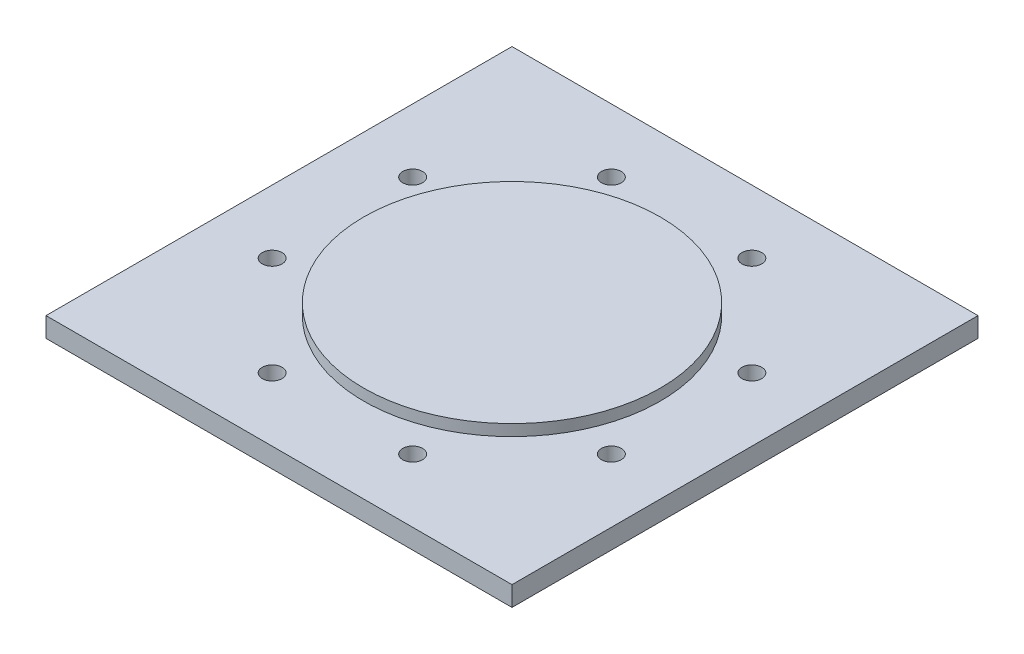
ISO-10303-21;
HEADER;
FILE_DESCRIPTION(('STEP AP214'),'2;1');
FILE_NAME('part.step','',(''),(''),'','','');
FILE_SCHEMA(('AUTOMOTIVE_DESIGN { 1 0 10303 214 1 1 1 1 }'));
ENDSEC;
DATA;
#1=APPLICATION_CONTEXT('core data for automotive mechanical design processes');
#2=APPLICATION_PROTOCOL_DEFINITION('international standard','automotive_design',2000,#1);
#3=PRODUCT_CONTEXT('',#1,'mechanical');
#4=PRODUCT('Part','Part','',(#3));
#5=PRODUCT_RELATED_PRODUCT_CATEGORY('part','',(#4));
#6=PRODUCT_DEFINITION_FORMATION('','',#4);
#7=PRODUCT_DEFINITION_CONTEXT('part definition',#1,'design');
#8=PRODUCT_DEFINITION('design','',#6,#7);
#9=PRODUCT_DEFINITION_SHAPE('','',#8);
#10=(LENGTH_UNIT() NAMED_UNIT(*) SI_UNIT(.MILLI.,.METRE.));
#11=(NAMED_UNIT(*) PLANE_ANGLE_UNIT() SI_UNIT($,.RADIAN.));
#12=(NAMED_UNIT(*) SI_UNIT($,.STERADIAN.) SOLID_ANGLE_UNIT());
#13=UNCERTAINTY_MEASURE_WITH_UNIT(LENGTH_MEASURE(1.E-05),#10,'distance_accuracy_value','');
#14=(GEOMETRIC_REPRESENTATION_CONTEXT(3) GLOBAL_UNCERTAINTY_ASSIGNED_CONTEXT((#13)) GLOBAL_UNIT_ASSIGNED_CONTEXT((#10,
#11,#12)) REPRESENTATION_CONTEXT('',''));
#15=CARTESIAN_POINT('',(0.,0.,0.));
#16=DIRECTION('',(0.,0.,1.));
#17=DIRECTION('',(1.,0.,0.));
#18=AXIS2_PLACEMENT_3D('',#15,#16,#17);
#19=CARTESIAN_POINT('',(0.,14.,0.));
#20=DIRECTION('',(0.,-1.,0.));
#21=DIRECTION('',(0.,0.,-1.));
#22=AXIS2_PLACEMENT_3D('',#19,#20,#21);
#23=PLANE('',#22);
#24=CARTESIAN_POINT('',(0.,14.,0.));
#25=DIRECTION('',(0.,-1.,0.));
#26=DIRECTION('',(0.,0.,-1.));
#27=AXIS2_PLACEMENT_3D('',#24,#25,#26);
#28=CIRCLE('',#27,105.);
#29=CARTESIAN_POINT('',(0.,14.,-105.));
#30=VERTEX_POINT('',#29);
#31=EDGE_CURVE('E11',#30,#30,#28,.F.);
#32=ORIENTED_EDGE('',*,*,#31,.F.);
#33=EDGE_LOOP('',(#32));
#34=FACE_BOUND('',#33,.T.);
#35=DIRECTION('',(0.,0.,-1.));
#36=VECTOR('',#35,1.);
#37=CARTESIAN_POINT('',(165.,14.,165.));
#38=LINE('',#37,#36);
#39=CARTESIAN_POINT('',(165.,14.,165.));
#40=VERTEX_POINT('',#39);
#41=CARTESIAN_POINT('',(165.,14.,-165.));
#42=VERTEX_POINT('',#41);
#43=EDGE_CURVE('E93',#40,#42,#38,.T.);
#44=ORIENTED_EDGE('',*,*,#43,.T.);
#45=DIRECTION('',(-1.,0.,0.));
#46=VECTOR('',#45,1.);
#47=CARTESIAN_POINT('',(-165.,14.,-165.));
#48=LINE('',#47,#46);
#49=CARTESIAN_POINT('',(-165.,14.,-165.));
#50=VERTEX_POINT('',#49);
#51=EDGE_CURVE('E88',#42,#50,#48,.T.);
#52=ORIENTED_EDGE('',*,*,#51,.T.);
#53=DIRECTION('',(0.,0.,1.));
#54=VECTOR('',#53,1.);
#55=CARTESIAN_POINT('',(-165.,14.,165.));
#56=LINE('',#55,#54);
#57=CARTESIAN_POINT('',(-165.,14.,165.));
#58=VERTEX_POINT('',#57);
#59=EDGE_CURVE('E91',#50,#58,#56,.T.);
#60=ORIENTED_EDGE('',*,*,#59,.T.);
#61=DIRECTION('',(1.,0.,0.));
#62=VECTOR('',#61,1.);
#63=CARTESIAN_POINT('',(-165.,14.,165.));
#64=LINE('',#63,#62);
#65=EDGE_CURVE('E57',#58,#40,#64,.T.);
#66=ORIENTED_EDGE('',*,*,#65,.T.);
#67=EDGE_LOOP('',(#44,#52,#60,#66));
#68=FACE_BOUND('',#67,.T.);
#69=CARTESIAN_POINT('',(120.104339226467,14.,-49.7488462074617));
#70=DIRECTION('',(0.,1.,0.));
#71=DIRECTION('',(0.,0.,1.));
#72=AXIS2_PLACEMENT_3D('',#69,#70,#71);
#73=CIRCLE('',#72,7.);
#74=CARTESIAN_POINT('',(120.104339226467,14.,-42.7488462074617));
#75=VERTEX_POINT('',#74);
#76=EDGE_CURVE('E109',#75,#75,#73,.T.);
#77=ORIENTED_EDGE('',*,*,#76,.F.);
#78=EDGE_LOOP('',(#77));
#79=FACE_BOUND('',#78,.T.);
#80=CARTESIAN_POINT('',(49.7488462074617,14.,-120.104339226467));
#81=DIRECTION('',(0.,1.,0.));
#82=DIRECTION('',(0.,0.,1.));
#83=AXIS2_PLACEMENT_3D('',#80,#81,#82);
#84=CIRCLE('',#83,7.);
#85=CARTESIAN_POINT('',(49.7488462074617,14.,-113.104339226467));
#86=VERTEX_POINT('',#85);
#87=EDGE_CURVE('E124',#86,#86,#84,.T.);
#88=ORIENTED_EDGE('',*,*,#87,.F.);
#89=EDGE_LOOP('',(#88));
#90=FACE_BOUND('',#89,.T.);
#91=CARTESIAN_POINT('',(-49.7488462074617,14.,-120.104339226467));
#92=DIRECTION('',(0.,1.,0.));
#93=DIRECTION('',(0.,0.,1.));
#94=AXIS2_PLACEMENT_3D('',#91,#92,#93);
#95=CIRCLE('',#94,7.);
#96=CARTESIAN_POINT('',(-49.7488462074617,14.,-113.104339226467));
#97=VERTEX_POINT('',#96);
#98=EDGE_CURVE('E130',#97,#97,#95,.T.);
#99=ORIENTED_EDGE('',*,*,#98,.F.);
#100=EDGE_LOOP('',(#99));
#101=FACE_BOUND('',#100,.T.);
#102=CARTESIAN_POINT('',(-120.104339226467,14.,-49.7488462074617));
#103=DIRECTION('',(0.,1.,0.));
#104=DIRECTION('',(0.,0.,1.));
#105=AXIS2_PLACEMENT_3D('',#102,#103,#104);
#106=CIRCLE('',#105,7.);
#107=CARTESIAN_POINT('',(-120.104339226467,14.,-42.7488462074617));
#108=VERTEX_POINT('',#107);
#109=EDGE_CURVE('E136',#108,#108,#106,.T.);
#110=ORIENTED_EDGE('',*,*,#109,.F.);
#111=EDGE_LOOP('',(#110));
#112=FACE_BOUND('',#111,.T.);
#113=CARTESIAN_POINT('',(-120.104339226467,14.,49.7488462074617));
#114=DIRECTION('',(0.,1.,0.));
#115=DIRECTION('',(0.,0.,1.));
#116=AXIS2_PLACEMENT_3D('',#113,#114,#115);
#117=CIRCLE('',#116,7.);
#118=CARTESIAN_POINT('',(-120.104339226467,14.,56.7488462074617));
#119=VERTEX_POINT('',#118);
#120=EDGE_CURVE('E142',#119,#119,#117,.T.);
#121=ORIENTED_EDGE('',*,*,#120,.F.);
#122=EDGE_LOOP('',(#121));
#123=FACE_BOUND('',#122,.T.);
#124=CARTESIAN_POINT('',(-49.7488462074617,14.,120.104339226467));
#125=DIRECTION('',(0.,1.,0.));
#126=DIRECTION('',(0.,0.,1.));
#127=AXIS2_PLACEMENT_3D('',#124,#125,#126);
#128=CIRCLE('',#127,7.00000000000003);
#129=CARTESIAN_POINT('',(-49.7488462074617,14.,127.104339226467));
#130=VERTEX_POINT('',#129);
#131=EDGE_CURVE('E148',#130,#130,#128,.T.);
#132=ORIENTED_EDGE('',*,*,#131,.F.);
#133=EDGE_LOOP('',(#132));
#134=FACE_BOUND('',#133,.T.);
#135=CARTESIAN_POINT('',(49.7488462074617,14.,120.104339226467));
#136=DIRECTION('',(0.,1.,0.));
#137=DIRECTION('',(0.,0.,1.));
#138=AXIS2_PLACEMENT_3D('',#135,#136,#137);
#139=CIRCLE('',#138,7.00000000000002);
#140=CARTESIAN_POINT('',(49.7488462074617,14.,127.104339226467));
#141=VERTEX_POINT('',#140);
#142=EDGE_CURVE('E154',#141,#141,#139,.T.);
#143=ORIENTED_EDGE('',*,*,#142,.F.);
#144=EDGE_LOOP('',(#143));
#145=FACE_BOUND('',#144,.T.);
#146=CARTESIAN_POINT('',(120.104339226467,14.,49.7488462074617));
#147=DIRECTION('',(0.,1.,0.));
#148=DIRECTION('',(0.,0.,1.));
#149=AXIS2_PLACEMENT_3D('',#146,#147,#148);
#150=CIRCLE('',#149,7.00000000000003);
#151=CARTESIAN_POINT('',(120.104339226467,14.,56.7488462074617));
#152=VERTEX_POINT('',#151);
#153=EDGE_CURVE('E160',#152,#152,#150,.T.);
#154=ORIENTED_EDGE('',*,*,#153,.F.);
#155=EDGE_LOOP('',(#154));
#156=FACE_BOUND('',#155,.T.);
#157=ADVANCED_FACE('F39',(#34,#68,#79,#90,#101,#112,#123,#134,#145,#156),#23,.F.);
#158=CARTESIAN_POINT('',(0.,0.,0.));
#159=DIRECTION('',(0.,-1.,0.));
#160=DIRECTION('',(0.,0.,-1.));
#161=AXIS2_PLACEMENT_3D('',#158,#159,#160);
#162=PLANE('',#161);
#163=CARTESIAN_POINT('',(49.7488462074617,0.,120.104339226467));
#164=DIRECTION('',(0.,1.,0.));
#165=DIRECTION('',(0.,0.,1.));
#166=AXIS2_PLACEMENT_3D('',#163,#164,#165);
#167=CIRCLE('',#166,7.00000000000002);
#168=CARTESIAN_POINT('',(49.7488462074617,0.,127.104339226467));
#169=VERTEX_POINT('',#168);
#170=EDGE_CURVE('E157',#169,#169,#167,.T.);
#171=ORIENTED_EDGE('',*,*,#170,.T.);
#172=EDGE_LOOP('',(#171));
#173=FACE_BOUND('',#172,.T.);
#174=CARTESIAN_POINT('',(-120.104339226467,0.,49.7488462074617));
#175=DIRECTION('',(0.,1.,0.));
#176=DIRECTION('',(0.,0.,1.));
#177=AXIS2_PLACEMENT_3D('',#174,#175,#176);
#178=CIRCLE('',#177,7.);
#179=CARTESIAN_POINT('',(-120.104339226467,0.,56.7488462074617));
#180=VERTEX_POINT('',#179);
#181=EDGE_CURVE('E145',#180,#180,#178,.T.);
#182=ORIENTED_EDGE('',*,*,#181,.T.);
#183=EDGE_LOOP('',(#182));
#184=FACE_BOUND('',#183,.T.);
#185=CARTESIAN_POINT('',(-49.7488462074617,0.,-120.104339226467));
#186=DIRECTION('',(0.,1.,0.));
#187=DIRECTION('',(0.,0.,1.));
#188=AXIS2_PLACEMENT_3D('',#185,#186,#187);
#189=CIRCLE('',#188,7.);
#190=CARTESIAN_POINT('',(-49.7488462074617,0.,-113.104339226467));
#191=VERTEX_POINT('',#190);
#192=EDGE_CURVE('E133',#191,#191,#189,.T.);
#193=ORIENTED_EDGE('',*,*,#192,.T.);
#194=EDGE_LOOP('',(#193));
#195=FACE_BOUND('',#194,.T.);
#196=CARTESIAN_POINT('',(120.104339226467,0.,-49.7488462074617));
#197=DIRECTION('',(0.,1.,0.));
#198=DIRECTION('',(0.,0.,1.));
#199=AXIS2_PLACEMENT_3D('',#196,#197,#198);
#200=CIRCLE('',#199,7.);
#201=CARTESIAN_POINT('',(120.104339226467,0.,-42.7488462074617));
#202=VERTEX_POINT('',#201);
#203=EDGE_CURVE('E121',#202,#202,#200,.T.);
#204=ORIENTED_EDGE('',*,*,#203,.T.);
#205=EDGE_LOOP('',(#204));
#206=FACE_BOUND('',#205,.T.);
#207=DIRECTION('',(0.,0.,-1.));
#208=VECTOR('',#207,1.);
#209=CARTESIAN_POINT('',(165.,0.,165.));
#210=LINE('',#209,#208);
#211=CARTESIAN_POINT('',(165.,0.,165.));
#212=VERTEX_POINT('',#211);
#213=CARTESIAN_POINT('',(165.,0.,-165.));
#214=VERTEX_POINT('',#213);
#215=EDGE_CURVE('E106',#212,#214,#210,.T.);
#216=ORIENTED_EDGE('',*,*,#215,.F.);
#217=DIRECTION('',(1.,0.,0.));
#218=VECTOR('',#217,1.);
#219=CARTESIAN_POINT('',(-165.,0.,165.));
#220=LINE('',#219,#218);
#221=CARTESIAN_POINT('',(-165.,0.,165.));
#222=VERTEX_POINT('',#221);
#223=EDGE_CURVE('E80',#222,#212,#220,.T.);
#224=ORIENTED_EDGE('',*,*,#223,.F.);
#225=DIRECTION('',(0.,0.,1.));
#226=VECTOR('',#225,1.);
#227=CARTESIAN_POINT('',(-165.,0.,165.));
#228=LINE('',#227,#226);
#229=CARTESIAN_POINT('',(-165.,0.,-165.));
#230=VERTEX_POINT('',#229);
#231=EDGE_CURVE('E74',#230,#222,#228,.T.);
#232=ORIENTED_EDGE('',*,*,#231,.F.);
#233=DIRECTION('',(-1.,0.,0.));
#234=VECTOR('',#233,1.);
#235=CARTESIAN_POINT('',(-165.,0.,-165.));
#236=LINE('',#235,#234);
#237=EDGE_CURVE('E98',#214,#230,#236,.T.);
#238=ORIENTED_EDGE('',*,*,#237,.F.);
#239=EDGE_LOOP('',(#216,#224,#232,#238));
#240=FACE_BOUND('',#239,.T.);
#241=CARTESIAN_POINT('',(49.7488462074617,0.,-120.104339226467));
#242=DIRECTION('',(0.,1.,0.));
#243=DIRECTION('',(0.,0.,1.));
#244=AXIS2_PLACEMENT_3D('',#241,#242,#243);
#245=CIRCLE('',#244,7.);
#246=CARTESIAN_POINT('',(49.7488462074617,0.,-113.104339226467));
#247=VERTEX_POINT('',#246);
#248=EDGE_CURVE('E127',#247,#247,#245,.T.);
#249=ORIENTED_EDGE('',*,*,#248,.T.);
#250=EDGE_LOOP('',(#249));
#251=FACE_BOUND('',#250,.T.);
#252=CARTESIAN_POINT('',(-120.104339226467,0.,-49.7488462074617));
#253=DIRECTION('',(0.,1.,0.));
#254=DIRECTION('',(0.,0.,1.));
#255=AXIS2_PLACEMENT_3D('',#252,#253,#254);
#256=CIRCLE('',#255,7.);
#257=CARTESIAN_POINT('',(-120.104339226467,0.,-42.7488462074617));
#258=VERTEX_POINT('',#257);
#259=EDGE_CURVE('E139',#258,#258,#256,.T.);
#260=ORIENTED_EDGE('',*,*,#259,.T.);
#261=EDGE_LOOP('',(#260));
#262=FACE_BOUND('',#261,.T.);
#263=CARTESIAN_POINT('',(-49.7488462074617,0.,120.104339226467));
#264=DIRECTION('',(0.,1.,0.));
#265=DIRECTION('',(0.,0.,1.));
#266=AXIS2_PLACEMENT_3D('',#263,#264,#265);
#267=CIRCLE('',#266,7.00000000000003);
#268=CARTESIAN_POINT('',(-49.7488462074617,0.,127.104339226467));
#269=VERTEX_POINT('',#268);
#270=EDGE_CURVE('E151',#269,#269,#267,.T.);
#271=ORIENTED_EDGE('',*,*,#270,.T.);
#272=EDGE_LOOP('',(#271));
#273=FACE_BOUND('',#272,.T.);
#274=CARTESIAN_POINT('',(120.104339226467,0.,49.7488462074617));
#275=DIRECTION('',(0.,1.,0.));
#276=DIRECTION('',(0.,0.,1.));
#277=AXIS2_PLACEMENT_3D('',#274,#275,#276);
#278=CIRCLE('',#277,7.00000000000003);
#279=CARTESIAN_POINT('',(120.104339226467,0.,56.7488462074617));
#280=VERTEX_POINT('',#279);
#281=EDGE_CURVE('E163',#280,#280,#278,.T.);
#282=ORIENTED_EDGE('',*,*,#281,.T.);
#283=EDGE_LOOP('',(#282));
#284=FACE_BOUND('',#283,.T.);
#285=ADVANCED_FACE('F117',(#173,#184,#195,#206,#240,#251,#262,#273,#284),#162,.T.);
#286=CARTESIAN_POINT('',(165.,14.,165.));
#287=DIRECTION('',(-1.,0.,0.));
#288=DIRECTION('',(0.,0.,1.));
#289=AXIS2_PLACEMENT_3D('',#286,#287,#288);
#290=PLANE('',#289);
#291=ORIENTED_EDGE('',*,*,#215,.T.);
#292=DIRECTION('',(0.,-1.,0.));
#293=VECTOR('',#292,1.);
#294=CARTESIAN_POINT('',(165.,14.,-165.));
#295=LINE('',#294,#293);
#296=EDGE_CURVE('E43',#42,#214,#295,.T.);
#297=ORIENTED_EDGE('',*,*,#296,.F.);
#298=ORIENTED_EDGE('',*,*,#43,.F.);
#299=DIRECTION('',(0.,-1.,0.));
#300=VECTOR('',#299,1.);
#301=CARTESIAN_POINT('',(165.,14.,165.));
#302=LINE('',#301,#300);
#303=EDGE_CURVE('E102',#40,#212,#302,.T.);
#304=ORIENTED_EDGE('',*,*,#303,.T.);
#305=EDGE_LOOP('',(#291,#297,#298,#304));
#306=FACE_BOUND('',#305,.T.);
#307=ADVANCED_FACE('F41',(#306),#290,.F.);
#308=CARTESIAN_POINT('',(-165.,14.,-165.));
#309=DIRECTION('',(0.,0.,1.));
#310=DIRECTION('',(1.,0.,0.));
#311=AXIS2_PLACEMENT_3D('',#308,#309,#310);
#312=PLANE('',#311);
#313=ORIENTED_EDGE('',*,*,#237,.T.);
#314=DIRECTION('',(0.,-1.,0.));
#315=VECTOR('',#314,1.);
#316=CARTESIAN_POINT('',(-165.,14.,-165.));
#317=LINE('',#316,#315);
#318=EDGE_CURVE('E96',#50,#230,#317,.T.);
#319=ORIENTED_EDGE('',*,*,#318,.F.);
#320=ORIENTED_EDGE('',*,*,#51,.F.);
#321=ORIENTED_EDGE('',*,*,#296,.T.);
#322=EDGE_LOOP('',(#313,#319,#320,#321));
#323=FACE_BOUND('',#322,.T.);
#324=ADVANCED_FACE('F97',(#323),#312,.F.);
#325=CARTESIAN_POINT('',(-165.,14.,165.));
#326=DIRECTION('',(1.,0.,0.));
#327=DIRECTION('',(0.,0.,-1.));
#328=AXIS2_PLACEMENT_3D('',#325,#326,#327);
#329=PLANE('',#328);
#330=ORIENTED_EDGE('',*,*,#231,.T.);
#331=DIRECTION('',(0.,-1.,0.));
#332=VECTOR('',#331,1.);
#333=CARTESIAN_POINT('',(-165.,14.,165.));
#334=LINE('',#333,#332);
#335=EDGE_CURVE('E99',#58,#222,#334,.T.);
#336=ORIENTED_EDGE('',*,*,#335,.F.);
#337=ORIENTED_EDGE('',*,*,#59,.F.);
#338=ORIENTED_EDGE('',*,*,#318,.T.);
#339=EDGE_LOOP('',(#330,#336,#337,#338));
#340=FACE_BOUND('',#339,.T.);
#341=ADVANCED_FACE('F100',(#340),#329,.F.);
#342=CARTESIAN_POINT('',(-165.,14.,165.));
#343=DIRECTION('',(0.,0.,-1.));
#344=DIRECTION('',(-1.,0.,0.));
#345=AXIS2_PLACEMENT_3D('',#342,#343,#344);
#346=PLANE('',#345);
#347=ORIENTED_EDGE('',*,*,#223,.T.);
#348=ORIENTED_EDGE('',*,*,#303,.F.);
#349=ORIENTED_EDGE('',*,*,#65,.F.);
#350=ORIENTED_EDGE('',*,*,#335,.T.);
#351=EDGE_LOOP('',(#347,#348,#349,#350));
#352=FACE_BOUND('',#351,.T.);
#353=ADVANCED_FACE('F114',(#352),#346,.F.);
#354=CARTESIAN_POINT('',(120.104339226467,14.,-49.7488462074617));
#355=DIRECTION('',(0.,-1.,0.));
#356=DIRECTION('',(0.,0.,-1.));
#357=AXIS2_PLACEMENT_3D('',#354,#355,#356);
#358=CYLINDRICAL_SURFACE('',#357,7.);
#359=ORIENTED_EDGE('',*,*,#76,.T.);
#360=EDGE_LOOP('',(#359));
#361=FACE_BOUND('',#360,.T.);
#362=ORIENTED_EDGE('',*,*,#203,.F.);
#363=EDGE_LOOP('',(#362));
#364=FACE_BOUND('',#363,.T.);
#365=ADVANCED_FACE('F189',(#361,#364),#358,.F.);
#366=CARTESIAN_POINT('',(49.7488462074617,14.,-120.104339226467));
#367=DIRECTION('',(0.,-1.,0.));
#368=DIRECTION('',(0.,0.,-1.));
#369=AXIS2_PLACEMENT_3D('',#366,#367,#368);
#370=CYLINDRICAL_SURFACE('',#369,7.);
#371=ORIENTED_EDGE('',*,*,#87,.T.);
#372=EDGE_LOOP('',(#371));
#373=FACE_BOUND('',#372,.T.);
#374=ORIENTED_EDGE('',*,*,#248,.F.);
#375=EDGE_LOOP('',(#374));
#376=FACE_BOUND('',#375,.T.);
#377=ADVANCED_FACE('F285',(#373,#376),#370,.F.);
#378=CARTESIAN_POINT('',(-49.7488462074617,14.,-120.104339226467));
#379=DIRECTION('',(0.,-1.,0.));
#380=DIRECTION('',(0.,0.,-1.));
#381=AXIS2_PLACEMENT_3D('',#378,#379,#380);
#382=CYLINDRICAL_SURFACE('',#381,7.);
#383=ORIENTED_EDGE('',*,*,#98,.T.);
#384=EDGE_LOOP('',(#383));
#385=FACE_BOUND('',#384,.T.);
#386=ORIENTED_EDGE('',*,*,#192,.F.);
#387=EDGE_LOOP('',(#386));
#388=FACE_BOUND('',#387,.T.);
#389=ADVANCED_FACE('F275',(#385,#388),#382,.F.);
#390=CARTESIAN_POINT('',(-120.104339226467,14.,-49.7488462074617));
#391=DIRECTION('',(0.,-1.,0.));
#392=DIRECTION('',(0.,0.,-1.));
#393=AXIS2_PLACEMENT_3D('',#390,#391,#392);
#394=CYLINDRICAL_SURFACE('',#393,7.);
#395=ORIENTED_EDGE('',*,*,#109,.T.);
#396=EDGE_LOOP('',(#395));
#397=FACE_BOUND('',#396,.T.);
#398=ORIENTED_EDGE('',*,*,#259,.F.);
#399=EDGE_LOOP('',(#398));
#400=FACE_BOUND('',#399,.T.);
#401=ADVANCED_FACE('F265',(#397,#400),#394,.F.);
#402=CARTESIAN_POINT('',(-120.104339226467,14.,49.7488462074617));
#403=DIRECTION('',(0.,-1.,0.));
#404=DIRECTION('',(0.,0.,-1.));
#405=AXIS2_PLACEMENT_3D('',#402,#403,#404);
#406=CYLINDRICAL_SURFACE('',#405,7.);
#407=ORIENTED_EDGE('',*,*,#120,.T.);
#408=EDGE_LOOP('',(#407));
#409=FACE_BOUND('',#408,.T.);
#410=ORIENTED_EDGE('',*,*,#181,.F.);
#411=EDGE_LOOP('',(#410));
#412=FACE_BOUND('',#411,.T.);
#413=ADVANCED_FACE('F255',(#409,#412),#406,.F.);
#414=CARTESIAN_POINT('',(-49.7488462074617,14.,120.104339226467));
#415=DIRECTION('',(0.,-1.,0.));
#416=DIRECTION('',(0.,0.,-1.));
#417=AXIS2_PLACEMENT_3D('',#414,#415,#416);
#418=CYLINDRICAL_SURFACE('',#417,7.00000000000003);
#419=ORIENTED_EDGE('',*,*,#131,.T.);
#420=EDGE_LOOP('',(#419));
#421=FACE_BOUND('',#420,.T.);
#422=ORIENTED_EDGE('',*,*,#270,.F.);
#423=EDGE_LOOP('',(#422));
#424=FACE_BOUND('',#423,.T.);
#425=ADVANCED_FACE('F245',(#421,#424),#418,.F.);
#426=CARTESIAN_POINT('',(49.7488462074617,14.,120.104339226467));
#427=DIRECTION('',(0.,-1.,0.));
#428=DIRECTION('',(0.,0.,-1.));
#429=AXIS2_PLACEMENT_3D('',#426,#427,#428);
#430=CYLINDRICAL_SURFACE('',#429,7.00000000000002);
#431=ORIENTED_EDGE('',*,*,#142,.T.);
#432=EDGE_LOOP('',(#431));
#433=FACE_BOUND('',#432,.T.);
#434=ORIENTED_EDGE('',*,*,#170,.F.);
#435=EDGE_LOOP('',(#434));
#436=FACE_BOUND('',#435,.T.);
#437=ADVANCED_FACE('F236',(#433,#436),#430,.F.);
#438=CARTESIAN_POINT('',(120.104339226467,14.,49.7488462074617));
#439=DIRECTION('',(0.,-1.,0.));
#440=DIRECTION('',(0.,0.,-1.));
#441=AXIS2_PLACEMENT_3D('',#438,#439,#440);
#442=CYLINDRICAL_SURFACE('',#441,7.00000000000003);
#443=ORIENTED_EDGE('',*,*,#153,.T.);
#444=EDGE_LOOP('',(#443));
#445=FACE_BOUND('',#444,.T.);
#446=ORIENTED_EDGE('',*,*,#281,.F.);
#447=EDGE_LOOP('',(#446));
#448=FACE_BOUND('',#447,.T.);
#449=ADVANCED_FACE('F177',(#445,#448),#442,.F.);
#450=CARTESIAN_POINT('',(0.,22.,0.));
#451=DIRECTION('',(0.,-1.,0.));
#452=DIRECTION('',(0.,0.,-1.));
#453=AXIS2_PLACEMENT_3D('',#450,#451,#452);
#454=CYLINDRICAL_SURFACE('',#453,105.);
#455=CARTESIAN_POINT('',(0.,22.,0.));
#456=DIRECTION('',(0.,1.,0.));
#457=DIRECTION('',(0.,0.,1.));
#458=AXIS2_PLACEMENT_3D('',#455,#456,#457);
#459=CIRCLE('',#458,105.);
#460=CARTESIAN_POINT('',(0.,22.,105.));
#461=VERTEX_POINT('',#460);
#462=EDGE_CURVE('E166',#461,#461,#459,.T.);
#463=ORIENTED_EDGE('',*,*,#462,.F.);
#464=EDGE_LOOP('',(#463));
#465=FACE_BOUND('',#464,.T.);
#466=ORIENTED_EDGE('',*,*,#31,.T.);
#467=EDGE_LOOP('',(#466));
#468=FACE_BOUND('',#467,.T.);
#469=ADVANCED_FACE('F174',(#465,#468),#454,.T.);
#470=CARTESIAN_POINT('',(0.,22.,0.));
#471=DIRECTION('',(0.,1.,0.));
#472=DIRECTION('',(0.,0.,1.));
#473=AXIS2_PLACEMENT_3D('',#470,#471,#472);
#474=PLANE('',#473);
#475=ORIENTED_EDGE('',*,*,#462,.T.);
#476=EDGE_LOOP('',(#475));
#477=FACE_BOUND('',#476,.T.);
#478=ADVANCED_FACE('F172',(#477),#474,.T.);
#479=CLOSED_SHELL('',(#157,#285,#307,#324,#341,#353,#365,#377,#389,#401,#413,#425,#437,#449,
#469,#478));
#480=MANIFOLD_SOLID_BREP('B2',#479);
#481=ADVANCED_BREP_SHAPE_REPRESENTATION('',(#18,#480),#14);
#482=SHAPE_DEFINITION_REPRESENTATION(#9,#481);
ENDSEC;
END-ISO-10303-21;
